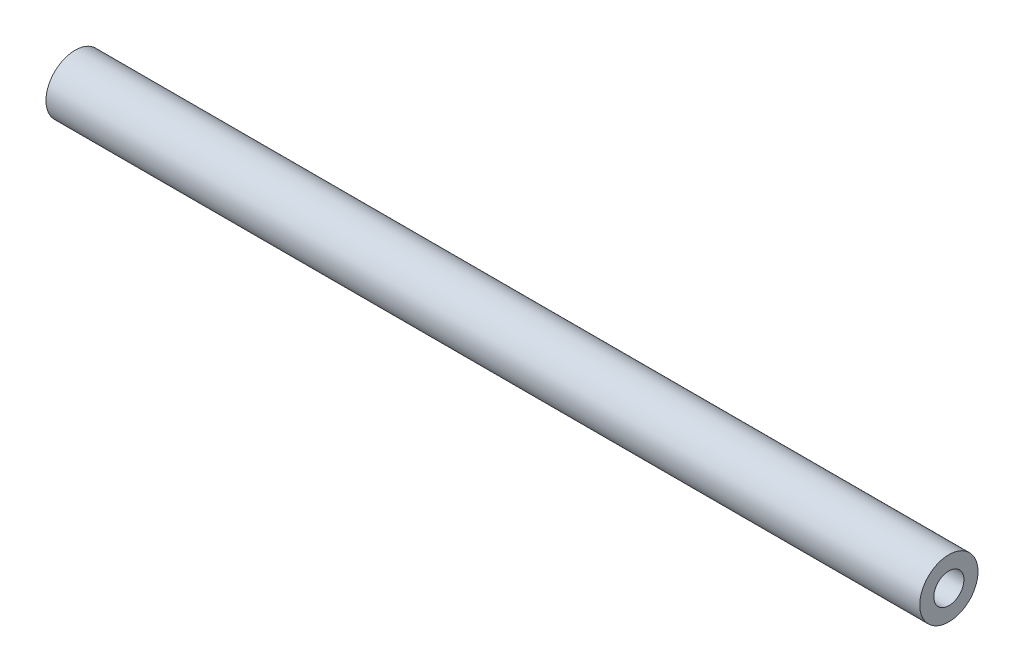
ISO-10303-21;
HEADER;
FILE_DESCRIPTION(('STEP AP214'),'2;1');
FILE_NAME('part.step','',(''),(''),'','','');
FILE_SCHEMA(('AUTOMOTIVE_DESIGN { 1 0 10303 214 1 1 1 1 }'));
ENDSEC;
DATA;
#1=APPLICATION_CONTEXT('core data for automotive mechanical design processes');
#2=APPLICATION_PROTOCOL_DEFINITION('international standard','automotive_design',2000,#1);
#3=PRODUCT_CONTEXT('',#1,'mechanical');
#4=PRODUCT('Part','Part','',(#3));
#5=PRODUCT_RELATED_PRODUCT_CATEGORY('part','',(#4));
#6=PRODUCT_DEFINITION_FORMATION('','',#4);
#7=PRODUCT_DEFINITION_CONTEXT('part definition',#1,'design');
#8=PRODUCT_DEFINITION('design','',#6,#7);
#9=PRODUCT_DEFINITION_SHAPE('','',#8);
#10=(LENGTH_UNIT() NAMED_UNIT(*) SI_UNIT(.MILLI.,.METRE.));
#11=(NAMED_UNIT(*) PLANE_ANGLE_UNIT() SI_UNIT($,.RADIAN.));
#12=(NAMED_UNIT(*) SI_UNIT($,.STERADIAN.) SOLID_ANGLE_UNIT());
#13=UNCERTAINTY_MEASURE_WITH_UNIT(LENGTH_MEASURE(1.E-05),#10,'distance_accuracy_value','');
#14=(GEOMETRIC_REPRESENTATION_CONTEXT(3) GLOBAL_UNCERTAINTY_ASSIGNED_CONTEXT((#13)) GLOBAL_UNIT_ASSIGNED_CONTEXT((#10,
#11,#12)) REPRESENTATION_CONTEXT('',''));
#15=CARTESIAN_POINT('',(0.,0.,0.));
#16=DIRECTION('',(0.,0.,1.));
#17=DIRECTION('',(1.,0.,0.));
#18=AXIS2_PLACEMENT_3D('',#15,#16,#17);
#19=CARTESIAN_POINT('',(-60.,0.,0.));
#20=DIRECTION('',(1.,0.,0.));
#21=DIRECTION('',(0.,0.,-1.));
#22=AXIS2_PLACEMENT_3D('',#19,#20,#21);
#23=PLANE('',#22);
#24=CARTESIAN_POINT('',(-60.,0.,0.));
#25=DIRECTION('',(1.,0.,0.));
#26=DIRECTION('',(0.,0.,-1.));
#27=AXIS2_PLACEMENT_3D('',#24,#25,#26);
#28=CIRCLE('',#27,2.067);
#29=CARTESIAN_POINT('',(-60.,0.,-2.067));
#30=VERTEX_POINT('',#29);
#31=EDGE_CURVE('E47',#30,#30,#28,.T.);
#32=ORIENTED_EDGE('',*,*,#31,.T.);
#33=EDGE_LOOP('',(#32));
#34=FACE_BOUND('',#33,.T.);
#35=CARTESIAN_POINT('',(-60.,0.,0.));
#36=DIRECTION('',(1.,0.,0.));
#37=DIRECTION('',(0.,0.,-1.));
#38=AXIS2_PLACEMENT_3D('',#35,#36,#37);
#39=CIRCLE('',#38,4.);
#40=CARTESIAN_POINT('',(-60.,0.,-4.));
#41=VERTEX_POINT('',#40);
#42=EDGE_CURVE('E42',#41,#41,#39,.T.);
#43=ORIENTED_EDGE('',*,*,#42,.F.);
#44=EDGE_LOOP('',(#43));
#45=FACE_BOUND('',#44,.T.);
#46=ADVANCED_FACE('F17',(#34,#45),#23,.F.);
#47=CARTESIAN_POINT('',(-38.806616993585,0.,0.));
#48=DIRECTION('',(1.,0.,0.));
#49=DIRECTION('',(0.,0.,-1.));
#50=AXIS2_PLACEMENT_3D('',#47,#48,#49);
#51=CYLINDRICAL_SURFACE('',#50,2.067);
#52=CARTESIAN_POINT('',(-40.,0.,0.));
#53=DIRECTION('',(1.,0.,0.));
#54=DIRECTION('',(0.,0.,-1.));
#55=AXIS2_PLACEMENT_3D('',#52,#53,#54);
#56=CIRCLE('',#55,2.067);
#57=CARTESIAN_POINT('',(-40.,0.,-2.067));
#58=VERTEX_POINT('',#57);
#59=EDGE_CURVE('E39',#58,#58,#56,.T.);
#60=ORIENTED_EDGE('',*,*,#59,.T.);
#61=EDGE_LOOP('',(#60));
#62=FACE_BOUND('',#61,.T.);
#63=ORIENTED_EDGE('',*,*,#31,.F.);
#64=EDGE_LOOP('',(#63));
#65=FACE_BOUND('',#64,.T.);
#66=ADVANCED_FACE('F63',(#62,#65),#51,.F.);
#67=CARTESIAN_POINT('',(60.,0.,0.));
#68=DIRECTION('',(1.,0.,0.));
#69=DIRECTION('',(0.,0.,-1.));
#70=AXIS2_PLACEMENT_3D('',#67,#68,#69);
#71=CYLINDRICAL_SURFACE('',#70,4.);
#72=CARTESIAN_POINT('',(60.,0.,0.));
#73=DIRECTION('',(1.,0.,0.));
#74=DIRECTION('',(0.,0.,-1.));
#75=AXIS2_PLACEMENT_3D('',#72,#73,#74);
#76=CIRCLE('',#75,4.);
#77=CARTESIAN_POINT('',(60.,0.,-4.));
#78=VERTEX_POINT('',#77);
#79=EDGE_CURVE('E41',#78,#78,#76,.T.);
#80=ORIENTED_EDGE('',*,*,#79,.F.);
#81=EDGE_LOOP('',(#80));
#82=FACE_BOUND('',#81,.T.);
#83=ORIENTED_EDGE('',*,*,#42,.T.);
#84=EDGE_LOOP('',(#83));
#85=FACE_BOUND('',#84,.T.);
#86=ADVANCED_FACE('F35',(#82,#85),#71,.T.);
#87=CARTESIAN_POINT('',(-40.,0.,0.));
#88=DIRECTION('',(-1.,0.,0.));
#89=DIRECTION('',(0.,0.,1.));
#90=AXIS2_PLACEMENT_3D('',#87,#88,#89);
#91=CONICAL_SURFACE('',#90,2.067,1.04719755119658);
#92=CARTESIAN_POINT('',(-38.806616993585,0.,0.));
#93=VERTEX_POINT('',#92);
#94=VERTEX_LOOP('',#93);
#95=FACE_BOUND('',#94,.T.);
#96=ORIENTED_EDGE('',*,*,#59,.F.);
#97=EDGE_LOOP('',(#96));
#98=FACE_BOUND('',#97,.T.);
#99=ADVANCED_FACE('F31',(#95,#98),#91,.F.);
#100=CARTESIAN_POINT('',(60.,4.,0.));
#101=DIRECTION('',(-1.,0.,0.));
#102=DIRECTION('',(0.,0.,1.));
#103=AXIS2_PLACEMENT_3D('',#100,#101,#102);
#104=PLANE('',#103);
#105=CARTESIAN_POINT('',(60.,0.,0.));
#106=DIRECTION('',(1.,0.,0.));
#107=DIRECTION('',(0.,0.,-1.));
#108=AXIS2_PLACEMENT_3D('',#105,#106,#107);
#109=CIRCLE('',#108,2.067);
#110=CARTESIAN_POINT('',(60.,0.,-2.067));
#111=VERTEX_POINT('',#110);
#112=EDGE_CURVE('E25',#111,#111,#109,.T.);
#113=ORIENTED_EDGE('',*,*,#112,.F.);
#114=EDGE_LOOP('',(#113));
#115=FACE_BOUND('',#114,.T.);
#116=ORIENTED_EDGE('',*,*,#79,.T.);
#117=EDGE_LOOP('',(#116));
#118=FACE_BOUND('',#117,.T.);
#119=ADVANCED_FACE('F34',(#115,#118),#104,.F.);
#120=CARTESIAN_POINT('',(60.,0.,0.));
#121=DIRECTION('',(1.,0.,0.));
#122=DIRECTION('',(0.,0.,-1.));
#123=AXIS2_PLACEMENT_3D('',#120,#121,#122);
#124=CYLINDRICAL_SURFACE('',#123,2.067);
#125=ORIENTED_EDGE('',*,*,#112,.T.);
#126=EDGE_LOOP('',(#125));
#127=FACE_BOUND('',#126,.T.);
#128=CARTESIAN_POINT('',(40.,0.,0.));
#129=DIRECTION('',(1.,0.,0.));
#130=DIRECTION('',(0.,0.,-1.));
#131=AXIS2_PLACEMENT_3D('',#128,#129,#130);
#132=CIRCLE('',#131,2.067);
#133=CARTESIAN_POINT('',(40.,0.,-2.067));
#134=VERTEX_POINT('',#133);
#135=EDGE_CURVE('E11',#134,#134,#132,.T.);
#136=ORIENTED_EDGE('',*,*,#135,.F.);
#137=EDGE_LOOP('',(#136));
#138=FACE_BOUND('',#137,.T.);
#139=ADVANCED_FACE('F53',(#127,#138),#124,.F.);
#140=CARTESIAN_POINT('',(38.806616993585,0.,0.));
#141=DIRECTION('',(1.,0.,0.));
#142=DIRECTION('',(0.,0.,-1.));
#143=AXIS2_PLACEMENT_3D('',#140,#141,#142);
#144=CONICAL_SURFACE('',#143,0.,1.04719755119658);
#145=ORIENTED_EDGE('',*,*,#135,.T.);
#146=EDGE_LOOP('',(#145));
#147=FACE_BOUND('',#146,.T.);
#148=CARTESIAN_POINT('',(38.806616993585,0.,0.));
#149=VERTEX_POINT('',#148);
#150=VERTEX_LOOP('',#149);
#151=FACE_BOUND('',#150,.T.);
#152=ADVANCED_FACE('F19',(#147,#151),#144,.F.);
#153=CLOSED_SHELL('',(#46,#66,#86,#99,#119,#139,#152));
#154=MANIFOLD_SOLID_BREP('B1',#153);
#155=ADVANCED_BREP_SHAPE_REPRESENTATION('',(#18,#154),#14);
#156=SHAPE_DEFINITION_REPRESENTATION(#9,#155);
ENDSEC;
END-ISO-10303-21;
